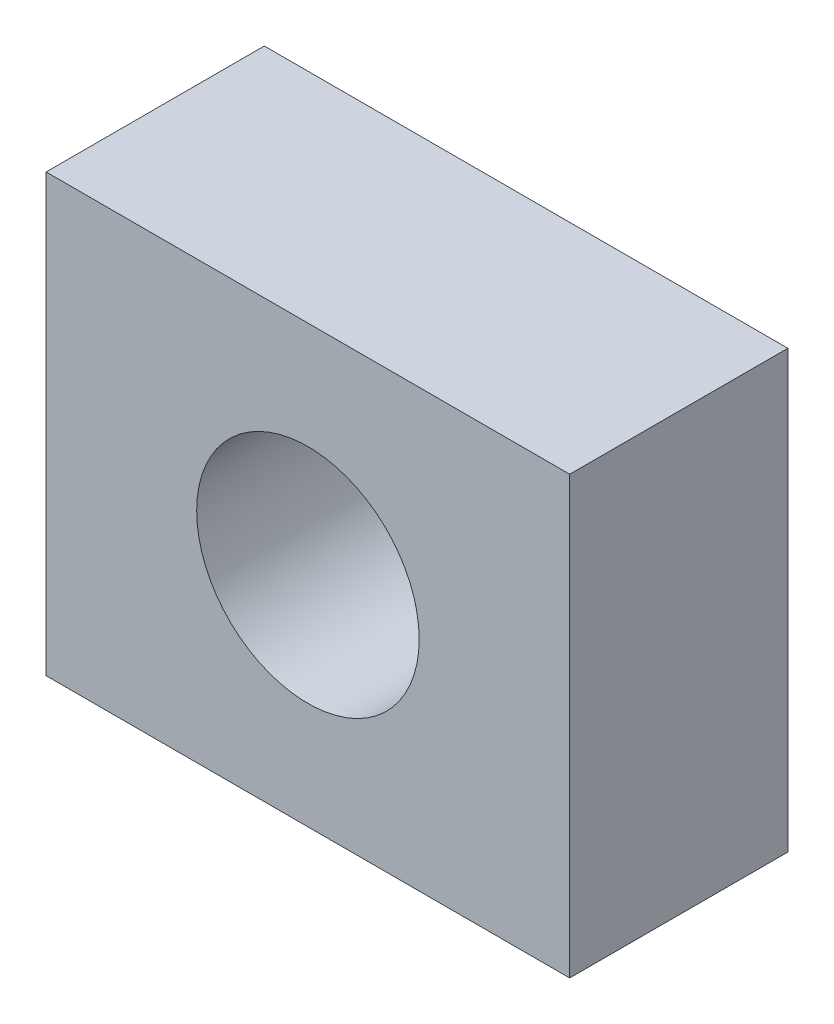
ISO-10303-21;
HEADER;
FILE_DESCRIPTION(('STEP AP214'),'2;1');
FILE_NAME('part.step','',(''),(''),'','','');
FILE_SCHEMA(('AUTOMOTIVE_DESIGN { 1 0 10303 214 1 1 1 1 }'));
ENDSEC;
DATA;
#1=APPLICATION_CONTEXT('core data for automotive mechanical design processes');
#2=APPLICATION_PROTOCOL_DEFINITION('international standard','automotive_design',2000,#1);
#3=PRODUCT_CONTEXT('',#1,'mechanical');
#4=PRODUCT('Part','Part','',(#3));
#5=PRODUCT_RELATED_PRODUCT_CATEGORY('part','',(#4));
#6=PRODUCT_DEFINITION_FORMATION('','',#4);
#7=PRODUCT_DEFINITION_CONTEXT('part definition',#1,'design');
#8=PRODUCT_DEFINITION('design','',#6,#7);
#9=PRODUCT_DEFINITION_SHAPE('','',#8);
#10=(LENGTH_UNIT() NAMED_UNIT(*) SI_UNIT(.MILLI.,.METRE.));
#11=(NAMED_UNIT(*) PLANE_ANGLE_UNIT() SI_UNIT($,.RADIAN.));
#12=(NAMED_UNIT(*) SI_UNIT($,.STERADIAN.) SOLID_ANGLE_UNIT());
#13=UNCERTAINTY_MEASURE_WITH_UNIT(LENGTH_MEASURE(1.E-05),#10,'distance_accuracy_value','');
#14=(GEOMETRIC_REPRESENTATION_CONTEXT(3) GLOBAL_UNCERTAINTY_ASSIGNED_CONTEXT((#13)) GLOBAL_UNIT_ASSIGNED_CONTEXT((#10,
#11,#12)) REPRESENTATION_CONTEXT('',''));
#15=CARTESIAN_POINT('',(0.,0.,0.));
#16=DIRECTION('',(0.,0.,1.));
#17=DIRECTION('',(1.,0.,0.));
#18=AXIS2_PLACEMENT_3D('',#15,#16,#17);
#19=CARTESIAN_POINT('',(0.,0.,5.));
#20=DIRECTION('',(0.,0.,1.));
#21=DIRECTION('',(1.,0.,0.));
#22=AXIS2_PLACEMENT_3D('',#19,#20,#21);
#23=PLANE('',#22);
#24=DIRECTION('',(0.,1.,0.));
#25=VECTOR('',#24,1.);
#26=CARTESIAN_POINT('',(6.,5.,5.));
#27=LINE('',#26,#25);
#28=CARTESIAN_POINT('',(6.,-5.,5.));
#29=VERTEX_POINT('',#28);
#30=CARTESIAN_POINT('',(6.,5.,5.));
#31=VERTEX_POINT('',#30);
#32=EDGE_CURVE('E92',#29,#31,#27,.T.);
#33=ORIENTED_EDGE('',*,*,#32,.T.);
#34=DIRECTION('',(-1.,0.,0.));
#35=VECTOR('',#34,1.);
#36=CARTESIAN_POINT('',(-6.,5.,5.));
#37=LINE('',#36,#35);
#38=CARTESIAN_POINT('',(-6.,5.,5.));
#39=VERTEX_POINT('',#38);
#40=EDGE_CURVE('E87',#31,#39,#37,.T.);
#41=ORIENTED_EDGE('',*,*,#40,.T.);
#42=DIRECTION('',(0.,-1.,0.));
#43=VECTOR('',#42,1.);
#44=CARTESIAN_POINT('',(-6.,5.,5.));
#45=LINE('',#44,#43);
#46=CARTESIAN_POINT('',(-6.,-5.,5.));
#47=VERTEX_POINT('',#46);
#48=EDGE_CURVE('E90',#39,#47,#45,.T.);
#49=ORIENTED_EDGE('',*,*,#48,.T.);
#50=DIRECTION('',(1.,0.,0.));
#51=VECTOR('',#50,1.);
#52=CARTESIAN_POINT('',(-6.,-5.,5.));
#53=LINE('',#52,#51);
#54=EDGE_CURVE('E57',#47,#29,#53,.T.);
#55=ORIENTED_EDGE('',*,*,#54,.T.);
#56=EDGE_LOOP('',(#33,#41,#49,#55));
#57=FACE_BOUND('',#56,.T.);
#58=CARTESIAN_POINT('',(0.,0.,5.));
#59=DIRECTION('',(0.,0.,1.));
#60=DIRECTION('',(1.,0.,0.));
#61=AXIS2_PLACEMENT_3D('',#58,#59,#60);
#62=CIRCLE('',#61,2.55);
#63=CARTESIAN_POINT('',(2.55,0.,5.));
#64=VERTEX_POINT('',#63);
#65=EDGE_CURVE('E112',#64,#64,#62,.T.);
#66=ORIENTED_EDGE('',*,*,#65,.F.);
#67=EDGE_LOOP('',(#66));
#68=FACE_BOUND('',#67,.T.);
#69=ADVANCED_FACE('F39',(#57,#68),#23,.T.);
#70=CARTESIAN_POINT('',(0.,0.,0.));
#71=DIRECTION('',(0.,0.,1.));
#72=DIRECTION('',(1.,0.,0.));
#73=AXIS2_PLACEMENT_3D('',#70,#71,#72);
#74=PLANE('',#73);
#75=DIRECTION('',(0.,1.,0.));
#76=VECTOR('',#75,1.);
#77=CARTESIAN_POINT('',(6.,5.,0.));
#78=LINE('',#77,#76);
#79=CARTESIAN_POINT('',(6.,-5.,0.));
#80=VERTEX_POINT('',#79);
#81=CARTESIAN_POINT('',(6.,5.,0.));
#82=VERTEX_POINT('',#81);
#83=EDGE_CURVE('E108',#80,#82,#78,.T.);
#84=ORIENTED_EDGE('',*,*,#83,.F.);
#85=DIRECTION('',(1.,0.,0.));
#86=VECTOR('',#85,1.);
#87=CARTESIAN_POINT('',(-6.,-5.,0.));
#88=LINE('',#87,#86);
#89=CARTESIAN_POINT('',(-6.,-5.,0.));
#90=VERTEX_POINT('',#89);
#91=EDGE_CURVE('E80',#90,#80,#88,.T.);
#92=ORIENTED_EDGE('',*,*,#91,.F.);
#93=DIRECTION('',(0.,-1.,0.));
#94=VECTOR('',#93,1.);
#95=CARTESIAN_POINT('',(-6.,5.,0.));
#96=LINE('',#95,#94);
#97=CARTESIAN_POINT('',(-6.,5.,0.));
#98=VERTEX_POINT('',#97);
#99=EDGE_CURVE('E74',#98,#90,#96,.T.);
#100=ORIENTED_EDGE('',*,*,#99,.F.);
#101=DIRECTION('',(-1.,0.,0.));
#102=VECTOR('',#101,1.);
#103=CARTESIAN_POINT('',(-6.,5.,0.));
#104=LINE('',#103,#102);
#105=EDGE_CURVE('E97',#82,#98,#104,.T.);
#106=ORIENTED_EDGE('',*,*,#105,.F.);
#107=EDGE_LOOP('',(#84,#92,#100,#106));
#108=FACE_BOUND('',#107,.T.);
#109=CARTESIAN_POINT('',(0.,0.,0.));
#110=DIRECTION('',(0.,0.,1.));
#111=DIRECTION('',(1.,0.,0.));
#112=AXIS2_PLACEMENT_3D('',#109,#110,#111);
#113=CIRCLE('',#112,2.55);
#114=CARTESIAN_POINT('',(2.55,0.,0.));
#115=VERTEX_POINT('',#114);
#116=EDGE_CURVE('E130',#115,#115,#113,.T.);
#117=ORIENTED_EDGE('',*,*,#116,.T.);
#118=EDGE_LOOP('',(#117));
#119=FACE_BOUND('',#118,.T.);
#120=ADVANCED_FACE('F125',(#108,#119),#74,.F.);
#121=CARTESIAN_POINT('',(6.,5.,5.));
#122=DIRECTION('',(-1.,0.,0.));
#123=DIRECTION('',(0.,-1.,0.));
#124=AXIS2_PLACEMENT_3D('',#121,#122,#123);
#125=PLANE('',#124);
#126=ORIENTED_EDGE('',*,*,#83,.T.);
#127=DIRECTION('',(0.,0.,-1.));
#128=VECTOR('',#127,1.);
#129=CARTESIAN_POINT('',(6.,5.,5.));
#130=LINE('',#129,#128);
#131=EDGE_CURVE('E11',#31,#82,#130,.T.);
#132=ORIENTED_EDGE('',*,*,#131,.F.);
#133=ORIENTED_EDGE('',*,*,#32,.F.);
#134=DIRECTION('',(0.,0.,-1.));
#135=VECTOR('',#134,1.);
#136=CARTESIAN_POINT('',(6.,-5.,5.));
#137=LINE('',#136,#135);
#138=EDGE_CURVE('E104',#29,#80,#137,.T.);
#139=ORIENTED_EDGE('',*,*,#138,.T.);
#140=EDGE_LOOP('',(#126,#132,#133,#139));
#141=FACE_BOUND('',#140,.T.);
#142=ADVANCED_FACE('F41',(#141),#125,.F.);
#143=CARTESIAN_POINT('',(-6.,5.,5.));
#144=DIRECTION('',(0.,-1.,0.));
#145=DIRECTION('',(0.,0.,-1.));
#146=AXIS2_PLACEMENT_3D('',#143,#144,#145);
#147=PLANE('',#146);
#148=ORIENTED_EDGE('',*,*,#105,.T.);
#149=DIRECTION('',(0.,0.,-1.));
#150=VECTOR('',#149,1.);
#151=CARTESIAN_POINT('',(-6.,5.,5.));
#152=LINE('',#151,#150);
#153=EDGE_CURVE('E49',#39,#98,#152,.T.);
#154=ORIENTED_EDGE('',*,*,#153,.F.);
#155=ORIENTED_EDGE('',*,*,#40,.F.);
#156=ORIENTED_EDGE('',*,*,#131,.T.);
#157=EDGE_LOOP('',(#148,#154,#155,#156));
#158=FACE_BOUND('',#157,.T.);
#159=ADVANCED_FACE('F96',(#158),#147,.F.);
#160=CARTESIAN_POINT('',(-6.,5.,5.));
#161=DIRECTION('',(1.,0.,0.));
#162=DIRECTION('',(0.,1.,0.));
#163=AXIS2_PLACEMENT_3D('',#160,#161,#162);
#164=PLANE('',#163);
#165=ORIENTED_EDGE('',*,*,#99,.T.);
#166=DIRECTION('',(0.,0.,-1.));
#167=VECTOR('',#166,1.);
#168=CARTESIAN_POINT('',(-6.,-5.,5.));
#169=LINE('',#168,#167);
#170=EDGE_CURVE('E99',#47,#90,#169,.T.);
#171=ORIENTED_EDGE('',*,*,#170,.F.);
#172=ORIENTED_EDGE('',*,*,#48,.F.);
#173=ORIENTED_EDGE('',*,*,#153,.T.);
#174=EDGE_LOOP('',(#165,#171,#172,#173));
#175=FACE_BOUND('',#174,.T.);
#176=ADVANCED_FACE('F100',(#175),#164,.F.);
#177=CARTESIAN_POINT('',(-6.,-5.,5.));
#178=DIRECTION('',(0.,1.,0.));
#179=DIRECTION('',(0.,0.,1.));
#180=AXIS2_PLACEMENT_3D('',#177,#178,#179);
#181=PLANE('',#180);
#182=ORIENTED_EDGE('',*,*,#91,.T.);
#183=ORIENTED_EDGE('',*,*,#138,.F.);
#184=ORIENTED_EDGE('',*,*,#54,.F.);
#185=ORIENTED_EDGE('',*,*,#170,.T.);
#186=EDGE_LOOP('',(#182,#183,#184,#185));
#187=FACE_BOUND('',#186,.T.);
#188=ADVANCED_FACE('F122',(#187),#181,.F.);
#189=CARTESIAN_POINT('',(0.,0.,5.));
#190=DIRECTION('',(0.,0.,-1.));
#191=DIRECTION('',(-1.,0.,0.));
#192=AXIS2_PLACEMENT_3D('',#189,#190,#191);
#193=CYLINDRICAL_SURFACE('',#192,2.55);
#194=ORIENTED_EDGE('',*,*,#65,.T.);
#195=EDGE_LOOP('',(#194));
#196=FACE_BOUND('',#195,.T.);
#197=ORIENTED_EDGE('',*,*,#116,.F.);
#198=EDGE_LOOP('',(#197));
#199=FACE_BOUND('',#198,.T.);
#200=ADVANCED_FACE('F138',(#196,#199),#193,.F.);
#201=CLOSED_SHELL('',(#69,#120,#142,#159,#176,#188,#200));
#202=MANIFOLD_SOLID_BREP('B2',#201);
#203=ADVANCED_BREP_SHAPE_REPRESENTATION('',(#18,#202),#14);
#204=SHAPE_DEFINITION_REPRESENTATION(#9,#203);
ENDSEC;
END-ISO-10303-21;
